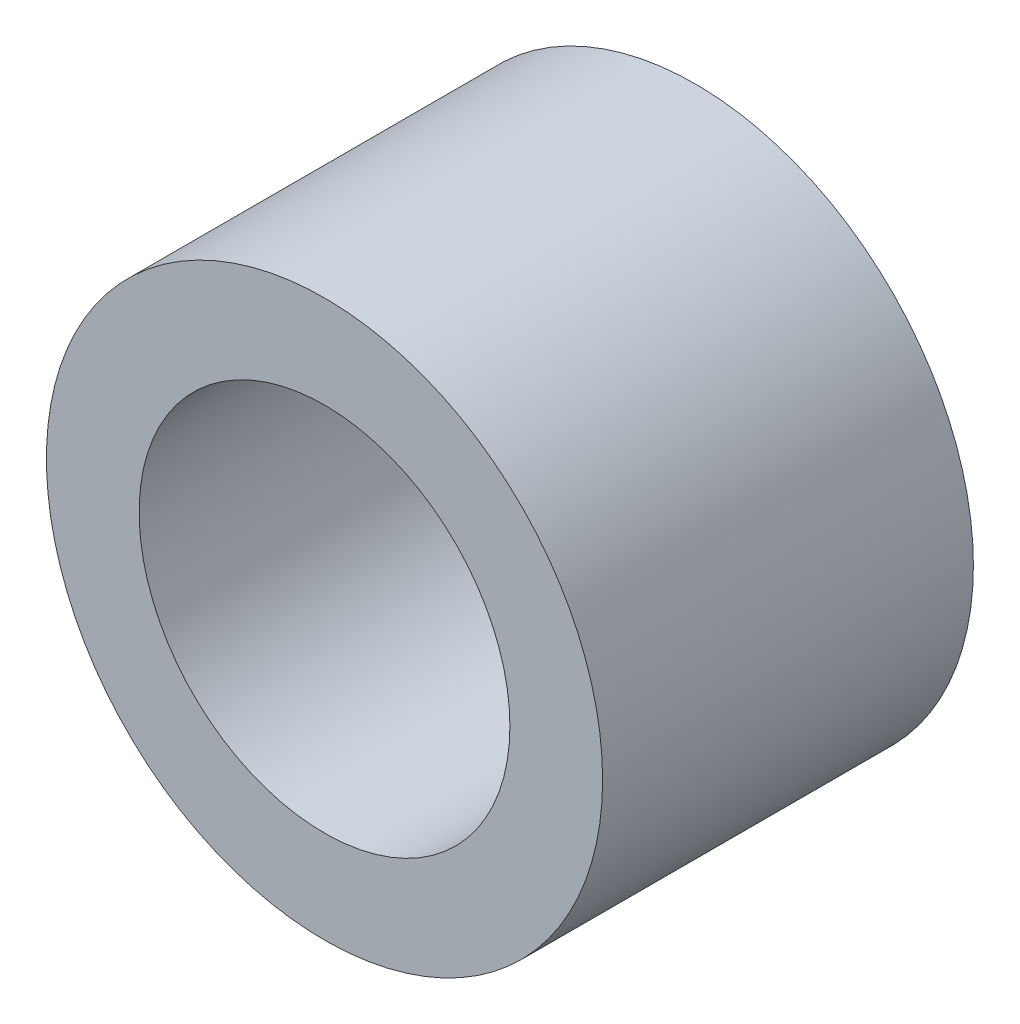
ISO-10303-21;
HEADER;
FILE_DESCRIPTION(('STEP AP214'),'2;1');
FILE_NAME('part.step','',(''),(''),'','','');
FILE_SCHEMA(('AUTOMOTIVE_DESIGN { 1 0 10303 214 1 1 1 1 }'));
ENDSEC;
DATA;
#1=APPLICATION_CONTEXT('core data for automotive mechanical design processes');
#2=APPLICATION_PROTOCOL_DEFINITION('international standard','automotive_design',2000,#1);
#3=PRODUCT_CONTEXT('',#1,'mechanical');
#4=PRODUCT('Part','Part','',(#3));
#5=PRODUCT_RELATED_PRODUCT_CATEGORY('part','',(#4));
#6=PRODUCT_DEFINITION_FORMATION('','',#4);
#7=PRODUCT_DEFINITION_CONTEXT('part definition',#1,'design');
#8=PRODUCT_DEFINITION('design','',#6,#7);
#9=PRODUCT_DEFINITION_SHAPE('','',#8);
#10=(LENGTH_UNIT() NAMED_UNIT(*) SI_UNIT(.MILLI.,.METRE.));
#11=(NAMED_UNIT(*) PLANE_ANGLE_UNIT() SI_UNIT($,.RADIAN.));
#12=(NAMED_UNIT(*) SI_UNIT($,.STERADIAN.) SOLID_ANGLE_UNIT());
#13=UNCERTAINTY_MEASURE_WITH_UNIT(LENGTH_MEASURE(1.E-05),#10,'distance_accuracy_value','');
#14=(GEOMETRIC_REPRESENTATION_CONTEXT(3) GLOBAL_UNCERTAINTY_ASSIGNED_CONTEXT((#13)) GLOBAL_UNIT_ASSIGNED_CONTEXT((#10,
#11,#12)) REPRESENTATION_CONTEXT('',''));
#15=CARTESIAN_POINT('',(0.,0.,0.));
#16=DIRECTION('',(0.,0.,1.));
#17=DIRECTION('',(1.,0.,0.));
#18=AXIS2_PLACEMENT_3D('',#15,#16,#17);
#19=CARTESIAN_POINT('',(0.,0.,12.7));
#20=DIRECTION('',(0.,0.,1.));
#21=DIRECTION('',(1.,0.,0.));
#22=AXIS2_PLACEMENT_3D('',#19,#20,#21);
#23=PLANE('',#22);
#24=CARTESIAN_POINT('',(0.,0.,12.7));
#25=DIRECTION('',(0.,0.,1.));
#26=DIRECTION('',(1.,0.,0.));
#27=AXIS2_PLACEMENT_3D('',#24,#25,#26);
#28=CIRCLE('',#27,9.525);
#29=CARTESIAN_POINT('',(9.525,0.,12.7));
#30=VERTEX_POINT('',#29);
#31=EDGE_CURVE('E10',#30,#30,#28,.T.);
#32=ORIENTED_EDGE('',*,*,#31,.T.);
#33=EDGE_LOOP('',(#32));
#34=FACE_BOUND('',#33,.T.);
#35=CARTESIAN_POINT('',(0.,0.,12.7));
#36=DIRECTION('',(0.,0.,1.));
#37=DIRECTION('',(1.,0.,0.));
#38=AXIS2_PLACEMENT_3D('',#35,#36,#37);
#39=CIRCLE('',#38,6.35);
#40=CARTESIAN_POINT('',(6.35,0.,12.7));
#41=VERTEX_POINT('',#40);
#42=EDGE_CURVE('E48',#41,#41,#39,.T.);
#43=ORIENTED_EDGE('',*,*,#42,.F.);
#44=EDGE_LOOP('',(#43));
#45=FACE_BOUND('',#44,.T.);
#46=ADVANCED_FACE('F37',(#34,#45),#23,.T.);
#47=CARTESIAN_POINT('',(0.,0.,0.));
#48=DIRECTION('',(0.,0.,1.));
#49=DIRECTION('',(1.,0.,0.));
#50=AXIS2_PLACEMENT_3D('',#47,#48,#49);
#51=PLANE('',#50);
#52=CARTESIAN_POINT('',(0.,0.,0.));
#53=DIRECTION('',(0.,0.,1.));
#54=DIRECTION('',(1.,0.,0.));
#55=AXIS2_PLACEMENT_3D('',#52,#53,#54);
#56=CIRCLE('',#55,9.525);
#57=CARTESIAN_POINT('',(9.525,0.,0.));
#58=VERTEX_POINT('',#57);
#59=EDGE_CURVE('E41',#58,#58,#56,.T.);
#60=ORIENTED_EDGE('',*,*,#59,.F.);
#61=EDGE_LOOP('',(#60));
#62=FACE_BOUND('',#61,.T.);
#63=CARTESIAN_POINT('',(0.,0.,0.));
#64=DIRECTION('',(0.,0.,1.));
#65=DIRECTION('',(1.,0.,0.));
#66=AXIS2_PLACEMENT_3D('',#63,#64,#65);
#67=CIRCLE('',#66,6.35);
#68=CARTESIAN_POINT('',(6.35,0.,0.));
#69=VERTEX_POINT('',#68);
#70=EDGE_CURVE('E50',#69,#69,#67,.T.);
#71=ORIENTED_EDGE('',*,*,#70,.T.);
#72=EDGE_LOOP('',(#71));
#73=FACE_BOUND('',#72,.T.);
#74=ADVANCED_FACE('F60',(#62,#73),#51,.F.);
#75=CARTESIAN_POINT('',(0.,0.,12.7));
#76=DIRECTION('',(0.,0.,-1.));
#77=DIRECTION('',(-1.,0.,0.));
#78=AXIS2_PLACEMENT_3D('',#75,#76,#77);
#79=CYLINDRICAL_SURFACE('',#78,9.525);
#80=ORIENTED_EDGE('',*,*,#31,.F.);
#81=EDGE_LOOP('',(#80));
#82=FACE_BOUND('',#81,.T.);
#83=ORIENTED_EDGE('',*,*,#59,.T.);
#84=EDGE_LOOP('',(#83));
#85=FACE_BOUND('',#84,.T.);
#86=ADVANCED_FACE('F39',(#82,#85),#79,.T.);
#87=CARTESIAN_POINT('',(0.,0.,12.7));
#88=DIRECTION('',(0.,0.,-1.));
#89=DIRECTION('',(-1.,0.,0.));
#90=AXIS2_PLACEMENT_3D('',#87,#88,#89);
#91=CYLINDRICAL_SURFACE('',#90,6.35);
#92=ORIENTED_EDGE('',*,*,#42,.T.);
#93=EDGE_LOOP('',(#92));
#94=FACE_BOUND('',#93,.T.);
#95=ORIENTED_EDGE('',*,*,#70,.F.);
#96=EDGE_LOOP('',(#95));
#97=FACE_BOUND('',#96,.T.);
#98=ADVANCED_FACE('F56',(#94,#97),#91,.F.);
#99=CLOSED_SHELL('',(#46,#74,#86,#98));
#100=MANIFOLD_SOLID_BREP('B2',#99);
#101=ADVANCED_BREP_SHAPE_REPRESENTATION('',(#18,#100),#14);
#102=SHAPE_DEFINITION_REPRESENTATION(#9,#101);
ENDSEC;
END-ISO-10303-21;
